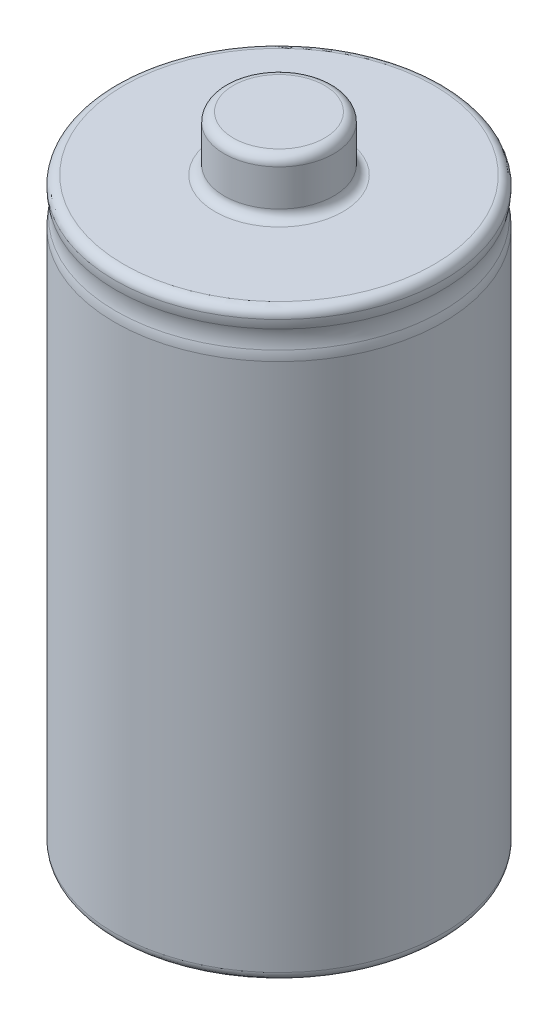
ISO-10303-21;
HEADER;
FILE_DESCRIPTION(('STEP AP214'),'2;1');
FILE_NAME('part.step','',(''),(''),'','','');
FILE_SCHEMA(('AUTOMOTIVE_DESIGN { 1 0 10303 214 1 1 1 1 }'));
ENDSEC;
DATA;
#1=APPLICATION_CONTEXT('core data for automotive mechanical design processes');
#2=APPLICATION_PROTOCOL_DEFINITION('international standard','automotive_design',2000,#1);
#3=PRODUCT_CONTEXT('',#1,'mechanical');
#4=PRODUCT('Part','Part','',(#3));
#5=PRODUCT_RELATED_PRODUCT_CATEGORY('part','',(#4));
#6=PRODUCT_DEFINITION_FORMATION('','',#4);
#7=PRODUCT_DEFINITION_CONTEXT('part definition',#1,'design');
#8=PRODUCT_DEFINITION('design','',#6,#7);
#9=PRODUCT_DEFINITION_SHAPE('','',#8);
#10=(LENGTH_UNIT() NAMED_UNIT(*) SI_UNIT(.MILLI.,.METRE.));
#11=(NAMED_UNIT(*) PLANE_ANGLE_UNIT() SI_UNIT($,.RADIAN.));
#12=(NAMED_UNIT(*) SI_UNIT($,.STERADIAN.) SOLID_ANGLE_UNIT());
#13=UNCERTAINTY_MEASURE_WITH_UNIT(LENGTH_MEASURE(1.E-05),#10,'distance_accuracy_value','');
#14=(GEOMETRIC_REPRESENTATION_CONTEXT(3) GLOBAL_UNCERTAINTY_ASSIGNED_CONTEXT((#13)) GLOBAL_UNIT_ASSIGNED_CONTEXT((#10,
#11,#12)) REPRESENTATION_CONTEXT('',''));
#15=CARTESIAN_POINT('',(0.,0.,0.));
#16=DIRECTION('',(0.,0.,1.));
#17=DIRECTION('',(1.,0.,0.));
#18=AXIS2_PLACEMENT_3D('',#15,#16,#17);
#19=CARTESIAN_POINT('',(0.,17.5,0.));
#20=DIRECTION('',(0.,1.,0.));
#21=DIRECTION('',(0.,0.,1.));
#22=AXIS2_PLACEMENT_3D('',#19,#20,#21);
#23=PLANE('',#22);
#24=CARTESIAN_POINT('',(0.,17.5,0.));
#25=DIRECTION('',(0.,1.,0.));
#26=DIRECTION('',(0.,0.,1.));
#27=AXIS2_PLACEMENT_3D('',#24,#25,#26);
#28=CIRCLE('',#27,2.5);
#29=CARTESIAN_POINT('',(0.,17.5,2.5));
#30=VERTEX_POINT('',#29);
#31=EDGE_CURVE('E61',#30,#30,#28,.T.);
#32=ORIENTED_EDGE('',*,*,#31,.T.);
#33=EDGE_LOOP('',(#32));
#34=FACE_BOUND('',#33,.T.);
#35=ADVANCED_FACE('F41',(#34),#23,.T.);
#36=CARTESIAN_POINT('',(0.,-17.5,0.));
#37=DIRECTION('',(0.,-1.,0.));
#38=DIRECTION('',(0.,0.,-1.));
#39=AXIS2_PLACEMENT_3D('',#36,#37,#38);
#40=CYLINDRICAL_SURFACE('',#39,3.);
#41=CARTESIAN_POINT('',(0.,17.,0.));
#42=DIRECTION('',(0.,1.,0.));
#43=DIRECTION('',(0.,0.,1.));
#44=AXIS2_PLACEMENT_3D('',#41,#42,#43);
#45=CIRCLE('',#44,3.);
#46=CARTESIAN_POINT('',(0.,17.,3.));
#47=VERTEX_POINT('',#46);
#48=EDGE_CURVE('E64',#47,#47,#45,.F.);
#49=ORIENTED_EDGE('',*,*,#48,.T.);
#50=EDGE_LOOP('',(#49));
#51=FACE_BOUND('',#50,.T.);
#52=CARTESIAN_POINT('',(0.,15.,0.));
#53=DIRECTION('',(0.,1.,0.));
#54=DIRECTION('',(0.,0.,1.));
#55=AXIS2_PLACEMENT_3D('',#52,#53,#54);
#56=CIRCLE('',#55,3.);
#57=CARTESIAN_POINT('',(0.,15.,3.));
#58=VERTEX_POINT('',#57);
#59=EDGE_CURVE('E67',#58,#58,#56,.T.);
#60=ORIENTED_EDGE('',*,*,#59,.T.);
#61=EDGE_LOOP('',(#60));
#62=FACE_BOUND('',#61,.T.);
#63=ADVANCED_FACE('F101',(#51,#62),#40,.T.);
#64=CARTESIAN_POINT('',(3.,14.5,0.));
#65=DIRECTION('',(0.,1.,0.));
#66=DIRECTION('',(0.,0.,1.));
#67=AXIS2_PLACEMENT_3D('',#64,#65,#66);
#68=PLANE('',#67);
#69=CARTESIAN_POINT('',(0.,14.5,0.));
#70=DIRECTION('',(0.,1.,0.));
#71=DIRECTION('',(0.,0.,1.));
#72=AXIS2_PLACEMENT_3D('',#69,#70,#71);
#73=CIRCLE('',#72,8.5);
#74=CARTESIAN_POINT('',(0.,14.5,8.5));
#75=VERTEX_POINT('',#74);
#76=EDGE_CURVE('E11',#75,#75,#73,.T.);
#77=ORIENTED_EDGE('',*,*,#76,.T.);
#78=EDGE_LOOP('',(#77));
#79=FACE_BOUND('',#78,.T.);
#80=CARTESIAN_POINT('',(0.,14.5,0.));
#81=DIRECTION('',(0.,1.,0.));
#82=DIRECTION('',(0.,0.,1.));
#83=AXIS2_PLACEMENT_3D('',#80,#81,#82);
#84=CIRCLE('',#83,3.5);
#85=CARTESIAN_POINT('',(0.,14.5,3.5));
#86=VERTEX_POINT('',#85);
#87=EDGE_CURVE('E48',#86,#86,#84,.F.);
#88=ORIENTED_EDGE('',*,*,#87,.T.);
#89=EDGE_LOOP('',(#88));
#90=FACE_BOUND('',#89,.T.);
#91=ADVANCED_FACE('F107',(#79,#90),#68,.T.);
#92=CARTESIAN_POINT('',(0.,17.,0.));
#93=DIRECTION('',(0.,1.,0.));
#94=DIRECTION('',(0.,0.,1.));
#95=AXIS2_PLACEMENT_3D('',#92,#93,#94);
#96=TOROIDAL_SURFACE('',#95,2.5,0.5);
#97=ORIENTED_EDGE('',*,*,#31,.F.);
#98=EDGE_LOOP('',(#97));
#99=FACE_BOUND('',#98,.T.);
#100=ORIENTED_EDGE('',*,*,#48,.F.);
#101=EDGE_LOOP('',(#100));
#102=FACE_BOUND('',#101,.T.);
#103=ADVANCED_FACE('F112',(#99,#102),#96,.T.);
#104=CARTESIAN_POINT('',(0.,14.,0.));
#105=DIRECTION('',(0.,1.,0.));
#106=DIRECTION('',(0.,0.,1.));
#107=AXIS2_PLACEMENT_3D('',#104,#105,#106);
#108=TOROIDAL_SURFACE('',#107,8.5,0.5);
#109=ORIENTED_EDGE('',*,*,#76,.F.);
#110=EDGE_LOOP('',(#109));
#111=FACE_BOUND('',#110,.T.);
#112=CARTESIAN_POINT('',(0.,14.,0.));
#113=DIRECTION('',(0.,1.,0.));
#114=DIRECTION('',(0.,0.,1.));
#115=AXIS2_PLACEMENT_3D('',#112,#113,#114);
#116=CIRCLE('',#115,9.);
#117=CARTESIAN_POINT('',(0.,14.,9.));
#118=VERTEX_POINT('',#117);
#119=EDGE_CURVE('E76',#118,#118,#116,.T.);
#120=ORIENTED_EDGE('',*,*,#119,.T.);
#121=EDGE_LOOP('',(#120));
#122=FACE_BOUND('',#121,.T.);
#123=ADVANCED_FACE('F97',(#111,#122),#108,.T.);
#124=CARTESIAN_POINT('',(0.,15.,0.));
#125=DIRECTION('',(0.,1.,0.));
#126=DIRECTION('',(0.,0.,1.));
#127=AXIS2_PLACEMENT_3D('',#124,#125,#126);
#128=TOROIDAL_SURFACE('',#127,3.5,0.5);
#129=ORIENTED_EDGE('',*,*,#59,.F.);
#130=EDGE_LOOP('',(#129));
#131=FACE_BOUND('',#130,.T.);
#132=ORIENTED_EDGE('',*,*,#87,.F.);
#133=EDGE_LOOP('',(#132));
#134=FACE_BOUND('',#133,.T.);
#135=ADVANCED_FACE('F43',(#131,#134),#128,.F.);
#136=CARTESIAN_POINT('',(0.,13.,0.));
#137=DIRECTION('',(0.,1.,0.));
#138=DIRECTION('',(0.,0.,1.));
#139=AXIS2_PLACEMENT_3D('',#136,#137,#138);
#140=TOROIDAL_SURFACE('',#139,10.8729833462074,2.);
#141=CARTESIAN_POINT('',(0.,12.5,0.));
#142=DIRECTION('',(0.,1.,0.));
#143=DIRECTION('',(0.,0.,1.));
#144=AXIS2_PLACEMENT_3D('',#141,#142,#143);
#145=CIRCLE('',#144,8.93649167310371);
#146=CARTESIAN_POINT('',(0.,12.5,8.93649167310371));
#147=VERTEX_POINT('',#146);
#148=EDGE_CURVE('E70',#147,#147,#145,.T.);
#149=ORIENTED_EDGE('',*,*,#148,.T.);
#150=EDGE_LOOP('',(#149));
#151=FACE_BOUND('',#150,.T.);
#152=CARTESIAN_POINT('',(0.,13.5,0.));
#153=DIRECTION('',(0.,1.,0.));
#154=DIRECTION('',(0.,0.,1.));
#155=AXIS2_PLACEMENT_3D('',#152,#153,#154);
#156=CIRCLE('',#155,8.93649167310371);
#157=CARTESIAN_POINT('',(0.,13.5,8.93649167310371));
#158=VERTEX_POINT('',#157);
#159=EDGE_CURVE('E79',#158,#158,#156,.T.);
#160=ORIENTED_EDGE('',*,*,#159,.F.);
#161=EDGE_LOOP('',(#160));
#162=FACE_BOUND('',#161,.T.);
#163=ADVANCED_FACE('F86',(#151,#162),#140,.F.);
#164=CARTESIAN_POINT('',(0.,12.,0.));
#165=DIRECTION('',(0.,1.,0.));
#166=DIRECTION('',(0.,0.,1.));
#167=AXIS2_PLACEMENT_3D('',#164,#165,#166);
#168=TOROIDAL_SURFACE('',#167,7.,2.);
#169=CARTESIAN_POINT('',(0.,12.,0.));
#170=DIRECTION('',(0.,1.,0.));
#171=DIRECTION('',(0.,0.,1.));
#172=AXIS2_PLACEMENT_3D('',#169,#170,#171);
#173=CIRCLE('',#172,9.);
#174=CARTESIAN_POINT('',(0.,12.,9.));
#175=VERTEX_POINT('',#174);
#176=EDGE_CURVE('E73',#175,#175,#173,.T.);
#177=ORIENTED_EDGE('',*,*,#176,.T.);
#178=EDGE_LOOP('',(#177));
#179=FACE_BOUND('',#178,.T.);
#180=ORIENTED_EDGE('',*,*,#148,.F.);
#181=EDGE_LOOP('',(#180));
#182=FACE_BOUND('',#181,.T.);
#183=ADVANCED_FACE('F88',(#179,#182),#168,.T.);
#184=CARTESIAN_POINT('',(0.,14.,0.));
#185=DIRECTION('',(0.,1.,0.));
#186=DIRECTION('',(0.,0.,1.));
#187=AXIS2_PLACEMENT_3D('',#184,#185,#186);
#188=TOROIDAL_SURFACE('',#187,7.00000000000001,2.);
#189=ORIENTED_EDGE('',*,*,#159,.T.);
#190=EDGE_LOOP('',(#189));
#191=FACE_BOUND('',#190,.T.);
#192=ORIENTED_EDGE('',*,*,#119,.F.);
#193=EDGE_LOOP('',(#192));
#194=FACE_BOUND('',#193,.T.);
#195=ADVANCED_FACE('F83',(#191,#194),#188,.T.);
#196=CARTESIAN_POINT('',(9.,-17.5,0.));
#197=DIRECTION('',(0.,-1.,0.));
#198=DIRECTION('',(0.,0.,-1.));
#199=AXIS2_PLACEMENT_3D('',#196,#197,#198);
#200=PLANE('',#199);
#201=CARTESIAN_POINT('',(0.,-17.5,0.));
#202=DIRECTION('',(0.,-1.,0.));
#203=DIRECTION('',(0.,0.,-1.));
#204=AXIS2_PLACEMENT_3D('',#201,#202,#203);
#205=CIRCLE('',#204,8.5);
#206=CARTESIAN_POINT('',(0.,-17.5,-8.5));
#207=VERTEX_POINT('',#206);
#208=EDGE_CURVE('E56',#207,#207,#205,.T.);
#209=ORIENTED_EDGE('',*,*,#208,.T.);
#210=EDGE_LOOP('',(#209));
#211=FACE_BOUND('',#210,.T.);
#212=ADVANCED_FACE('F119',(#211),#200,.T.);
#213=CARTESIAN_POINT('',(0.,-17.,0.));
#214=DIRECTION('',(0.,-1.,0.));
#215=DIRECTION('',(0.,0.,-1.));
#216=AXIS2_PLACEMENT_3D('',#213,#214,#215);
#217=TOROIDAL_SURFACE('',#216,8.5,0.5);
#218=CARTESIAN_POINT('',(0.,-17.,0.));
#219=DIRECTION('',(0.,-1.,0.));
#220=DIRECTION('',(0.,0.,-1.));
#221=AXIS2_PLACEMENT_3D('',#218,#219,#220);
#222=CIRCLE('',#221,9.);
#223=CARTESIAN_POINT('',(0.,-17.,-9.));
#224=VERTEX_POINT('',#223);
#225=EDGE_CURVE('E52',#224,#224,#222,.F.);
#226=ORIENTED_EDGE('',*,*,#225,.F.);
#227=EDGE_LOOP('',(#226));
#228=FACE_BOUND('',#227,.T.);
#229=ORIENTED_EDGE('',*,*,#208,.F.);
#230=EDGE_LOOP('',(#229));
#231=FACE_BOUND('',#230,.T.);
#232=ADVANCED_FACE('F116',(#228,#231),#217,.T.);
#233=CARTESIAN_POINT('',(0.,-17.5,0.));
#234=DIRECTION('',(0.,-1.,0.));
#235=DIRECTION('',(0.,0.,-1.));
#236=AXIS2_PLACEMENT_3D('',#233,#234,#235);
#237=CYLINDRICAL_SURFACE('',#236,9.);
#238=ORIENTED_EDGE('',*,*,#225,.T.);
#239=EDGE_LOOP('',(#238));
#240=FACE_BOUND('',#239,.T.);
#241=ORIENTED_EDGE('',*,*,#176,.F.);
#242=EDGE_LOOP('',(#241));
#243=FACE_BOUND('',#242,.T.);
#244=ADVANCED_FACE('F118',(#240,#243),#237,.T.);
#245=CLOSED_SHELL('',(#35,#63,#91,#103,#123,#135,#163,#183,#195,#212,#232,#244));
#246=MANIFOLD_SOLID_BREP('B2',#245);
#247=ADVANCED_BREP_SHAPE_REPRESENTATION('',(#18,#246),#14);
#248=SHAPE_DEFINITION_REPRESENTATION(#9,#247);
ENDSEC;
END-ISO-10303-21;
